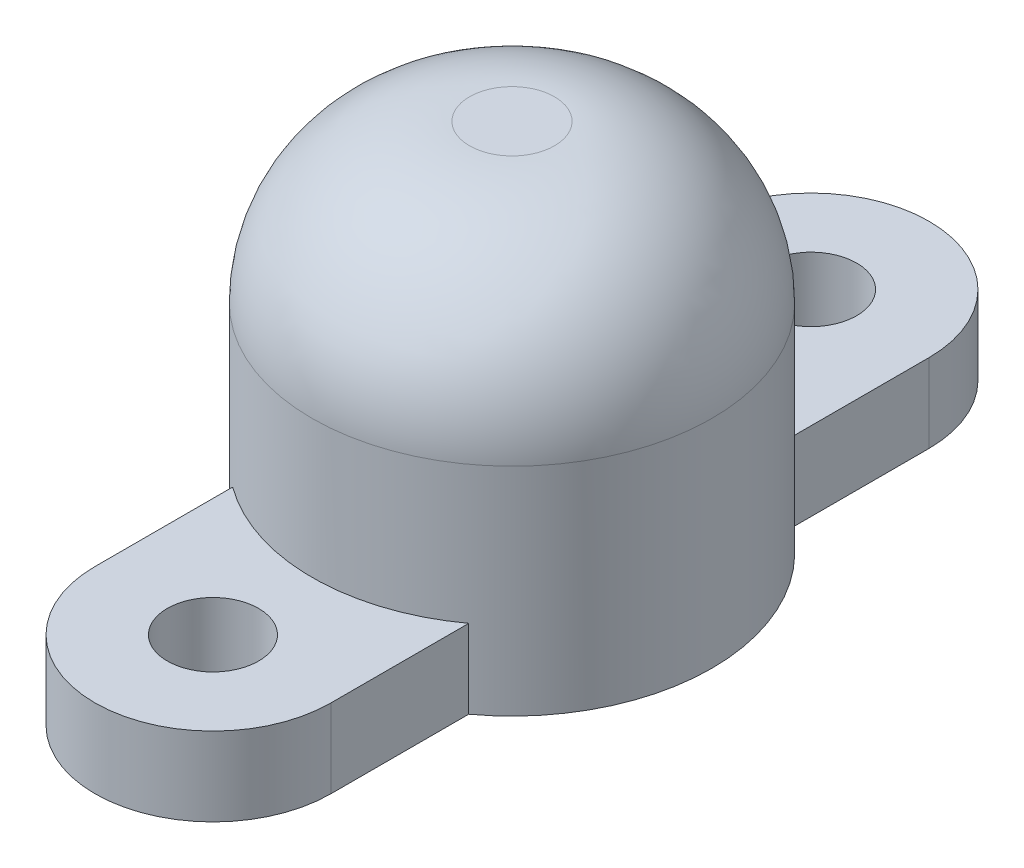
ISO-10303-21;
HEADER;
FILE_DESCRIPTION(('STEP AP214'),'2;1');
FILE_NAME('part.step','',(''),(''),'','','');
FILE_SCHEMA(('AUTOMOTIVE_DESIGN { 1 0 10303 214 1 1 1 1 }'));
ENDSEC;
DATA;
#1=APPLICATION_CONTEXT('core data for automotive mechanical design processes');
#2=APPLICATION_PROTOCOL_DEFINITION('international standard','automotive_design',2000,#1);
#3=PRODUCT_CONTEXT('',#1,'mechanical');
#4=PRODUCT('Part','Part','',(#3));
#5=PRODUCT_RELATED_PRODUCT_CATEGORY('part','',(#4));
#6=PRODUCT_DEFINITION_FORMATION('','',#4);
#7=PRODUCT_DEFINITION_CONTEXT('part definition',#1,'design');
#8=PRODUCT_DEFINITION('design','',#6,#7);
#9=PRODUCT_DEFINITION_SHAPE('','',#8);
#10=(LENGTH_UNIT() NAMED_UNIT(*) SI_UNIT(.MILLI.,.METRE.));
#11=(NAMED_UNIT(*) PLANE_ANGLE_UNIT() SI_UNIT($,.RADIAN.));
#12=(NAMED_UNIT(*) SI_UNIT($,.STERADIAN.) SOLID_ANGLE_UNIT());
#13=UNCERTAINTY_MEASURE_WITH_UNIT(LENGTH_MEASURE(1.E-05),#10,'distance_accuracy_value','');
#14=(GEOMETRIC_REPRESENTATION_CONTEXT(3) GLOBAL_UNCERTAINTY_ASSIGNED_CONTEXT((#13)) GLOBAL_UNIT_ASSIGNED_CONTEXT((#10,
#11,#12)) REPRESENTATION_CONTEXT('',''));
#15=CARTESIAN_POINT('',(0.,0.,0.));
#16=DIRECTION('',(0.,0.,1.));
#17=DIRECTION('',(1.,0.,0.));
#18=AXIS2_PLACEMENT_3D('',#15,#16,#17);
#19=CARTESIAN_POINT('',(0.,23.75,0.));
#20=DIRECTION('',(0.,-1.,0.));
#21=DIRECTION('',(0.,0.,-1.));
#22=AXIS2_PLACEMENT_3D('',#19,#20,#21);
#23=CYLINDRICAL_SURFACE('',#22,12.7);
#24=CARTESIAN_POINT('',(0.,5.,0.));
#25=DIRECTION('',(0.,-1.,0.));
#26=DIRECTION('',(0.,0.,-1.));
#27=AXIS2_PLACEMENT_3D('',#24,#25,#26);
#28=CIRCLE('',#27,12.7);
#29=CARTESIAN_POINT('',(7.49999999999999,5.,10.2489023802552));
#30=VERTEX_POINT('',#29);
#31=CARTESIAN_POINT('',(-7.5,5.,10.2489023802552));
#32=VERTEX_POINT('',#31);
#33=EDGE_CURVE('E11',#30,#32,#28,.T.);
#34=ORIENTED_EDGE('',*,*,#33,.F.);
#35=DIRECTION('',(0.,-1.,0.));
#36=VECTOR('',#35,1.);
#37=CARTESIAN_POINT('',(7.49999999999999,23.75,10.2489023802552));
#38=LINE('',#37,#36);
#39=CARTESIAN_POINT('',(7.49999999999999,0.,10.2489023802552));
#40=VERTEX_POINT('',#39);
#41=EDGE_CURVE('E159',#30,#40,#38,.T.);
#42=ORIENTED_EDGE('',*,*,#41,.T.);
#43=CARTESIAN_POINT('',(0.,0.,0.));
#44=DIRECTION('',(0.,1.,0.));
#45=DIRECTION('',(0.,0.,1.));
#46=AXIS2_PLACEMENT_3D('',#43,#44,#45);
#47=CIRCLE('',#46,12.7);
#48=CARTESIAN_POINT('',(7.5,0.,-10.2489023802552));
#49=VERTEX_POINT('',#48);
#50=EDGE_CURVE('E162',#40,#49,#47,.T.);
#51=ORIENTED_EDGE('',*,*,#50,.T.);
#52=DIRECTION('',(0.,-1.,0.));
#53=VECTOR('',#52,1.);
#54=CARTESIAN_POINT('',(7.5,23.75,-10.2489023802552));
#55=LINE('',#54,#53);
#56=CARTESIAN_POINT('',(7.5,5.,-10.2489023802552));
#57=VERTEX_POINT('',#56);
#58=EDGE_CURVE('E157',#49,#57,#55,.F.);
#59=ORIENTED_EDGE('',*,*,#58,.T.);
#60=CARTESIAN_POINT('',(-7.5,5.,-10.2489023802552));
#61=VERTEX_POINT('',#60);
#62=EDGE_CURVE('E43',#61,#57,#28,.T.);
#63=ORIENTED_EDGE('',*,*,#62,.F.);
#64=DIRECTION('',(0.,-1.,0.));
#65=VECTOR('',#64,1.);
#66=CARTESIAN_POINT('',(-7.5,23.75,-10.2489023802552));
#67=LINE('',#66,#65);
#68=CARTESIAN_POINT('',(-7.5,0.,-10.2489023802552));
#69=VERTEX_POINT('',#68);
#70=EDGE_CURVE('E154',#61,#69,#67,.T.);
#71=ORIENTED_EDGE('',*,*,#70,.T.);
#72=CARTESIAN_POINT('',(-7.5,0.,10.2489023802552));
#73=VERTEX_POINT('',#72);
#74=EDGE_CURVE('E161',#69,#73,#47,.T.);
#75=ORIENTED_EDGE('',*,*,#74,.T.);
#76=DIRECTION('',(0.,-1.,0.));
#77=VECTOR('',#76,1.);
#78=CARTESIAN_POINT('',(-7.5,23.75,10.2489023802552));
#79=LINE('',#78,#77);
#80=EDGE_CURVE('E54',#73,#32,#79,.F.);
#81=ORIENTED_EDGE('',*,*,#80,.T.);
#82=EDGE_LOOP('',(#34,#42,#51,#59,#63,#71,#75,#81));
#83=FACE_BOUND('',#82,.T.);
#84=CARTESIAN_POINT('',(0.,13.75,0.));
#85=DIRECTION('',(0.,1.,0.));
#86=DIRECTION('',(0.,0.,1.));
#87=AXIS2_PLACEMENT_3D('',#84,#85,#86);
#88=CIRCLE('',#87,12.7);
#89=CARTESIAN_POINT('',(0.,13.75,12.7));
#90=VERTEX_POINT('',#89);
#91=EDGE_CURVE('E166',#90,#90,#88,.F.);
#92=ORIENTED_EDGE('',*,*,#91,.T.);
#93=EDGE_LOOP('',(#92));
#94=FACE_BOUND('',#93,.T.);
#95=ADVANCED_FACE('F39',(#83,#94),#23,.T.);
#96=CARTESIAN_POINT('',(0.,23.75,0.));
#97=DIRECTION('',(0.,1.,0.));
#98=DIRECTION('',(0.,0.,1.));
#99=AXIS2_PLACEMENT_3D('',#96,#97,#98);
#100=PLANE('',#99);
#101=CARTESIAN_POINT('',(0.,23.75,0.));
#102=DIRECTION('',(0.,1.,0.));
#103=DIRECTION('',(0.,0.,1.));
#104=AXIS2_PLACEMENT_3D('',#101,#102,#103);
#105=CIRCLE('',#104,2.7);
#106=CARTESIAN_POINT('',(0.,23.75,2.7));
#107=VERTEX_POINT('',#106);
#108=EDGE_CURVE('E164',#107,#107,#105,.T.);
#109=ORIENTED_EDGE('',*,*,#108,.T.);
#110=EDGE_LOOP('',(#109));
#111=FACE_BOUND('',#110,.T.);
#112=ADVANCED_FACE('F206',(#111),#100,.T.);
#113=CARTESIAN_POINT('',(0.,0.,0.));
#114=DIRECTION('',(0.,1.,0.));
#115=DIRECTION('',(0.,0.,1.));
#116=AXIS2_PLACEMENT_3D('',#113,#114,#115);
#117=PLANE('',#116);
#118=ORIENTED_EDGE('',*,*,#74,.F.);
#119=DIRECTION('',(0.,0.,-1.));
#120=VECTOR('',#119,1.);
#121=CARTESIAN_POINT('',(-7.50000000000001,0.,19.));
#122=LINE('',#121,#120);
#123=CARTESIAN_POINT('',(-7.49999999999999,0.,-19.));
#124=VERTEX_POINT('',#123);
#125=EDGE_CURVE('E142',#69,#124,#122,.T.);
#126=ORIENTED_EDGE('',*,*,#125,.T.);
#127=CARTESIAN_POINT('',(0.,0.,-19.));
#128=DIRECTION('',(0.,-1.,0.));
#129=DIRECTION('',(0.,0.,-1.));
#130=AXIS2_PLACEMENT_3D('',#127,#128,#129);
#131=CIRCLE('',#130,7.5);
#132=CARTESIAN_POINT('',(7.5,0.,-19.));
#133=VERTEX_POINT('',#132);
#134=EDGE_CURVE('E145',#124,#133,#131,.T.);
#135=ORIENTED_EDGE('',*,*,#134,.T.);
#136=DIRECTION('',(0.,0.,1.));
#137=VECTOR('',#136,1.);
#138=CARTESIAN_POINT('',(7.49999999999999,0.,19.));
#139=LINE('',#138,#137);
#140=EDGE_CURVE('E126',#133,#49,#139,.T.);
#141=ORIENTED_EDGE('',*,*,#140,.T.);
#142=ORIENTED_EDGE('',*,*,#50,.F.);
#143=CARTESIAN_POINT('',(7.49999999999999,0.,19.));
#144=VERTEX_POINT('',#143);
#145=EDGE_CURVE('E129',#40,#144,#139,.T.);
#146=ORIENTED_EDGE('',*,*,#145,.T.);
#147=CARTESIAN_POINT('',(0.,0.,19.));
#148=DIRECTION('',(0.,-1.,0.));
#149=DIRECTION('',(0.,0.,-1.));
#150=AXIS2_PLACEMENT_3D('',#147,#148,#149);
#151=CIRCLE('',#150,7.5);
#152=CARTESIAN_POINT('',(-7.50000000000001,0.,19.));
#153=VERTEX_POINT('',#152);
#154=EDGE_CURVE('E140',#144,#153,#151,.T.);
#155=ORIENTED_EDGE('',*,*,#154,.T.);
#156=EDGE_CURVE('E106',#153,#73,#122,.T.);
#157=ORIENTED_EDGE('',*,*,#156,.T.);
#158=EDGE_LOOP('',(#118,#126,#135,#141,#142,#146,#155,#157));
#159=FACE_BOUND('',#158,.T.);
#160=CARTESIAN_POINT('',(0.,0.,-19.));
#161=DIRECTION('',(0.,-1.,0.));
#162=DIRECTION('',(0.,0.,-1.));
#163=AXIS2_PLACEMENT_3D('',#160,#161,#162);
#164=CIRCLE('',#163,2.9);
#165=CARTESIAN_POINT('',(0.,0.,-21.9));
#166=VERTEX_POINT('',#165);
#167=EDGE_CURVE('E246',#166,#166,#164,.T.);
#168=ORIENTED_EDGE('',*,*,#167,.F.);
#169=EDGE_LOOP('',(#168));
#170=FACE_BOUND('',#169,.T.);
#171=CARTESIAN_POINT('',(0.,0.,19.));
#172=DIRECTION('',(0.,-1.,0.));
#173=DIRECTION('',(0.,0.,-1.));
#174=AXIS2_PLACEMENT_3D('',#171,#172,#173);
#175=CIRCLE('',#174,2.9);
#176=CARTESIAN_POINT('',(0.,0.,16.1));
#177=VERTEX_POINT('',#176);
#178=EDGE_CURVE('E132',#177,#177,#175,.T.);
#179=ORIENTED_EDGE('',*,*,#178,.F.);
#180=EDGE_LOOP('',(#179));
#181=FACE_BOUND('',#180,.T.);
#182=ADVANCED_FACE('F189',(#159,#170,#181),#117,.F.);
#183=CARTESIAN_POINT('',(0.,13.75,0.));
#184=DIRECTION('',(0.,1.,0.));
#185=DIRECTION('',(0.,0.,1.));
#186=AXIS2_PLACEMENT_3D('',#183,#184,#185);
#187=DEGENERATE_TOROIDAL_SURFACE('',#186,2.7,10.,.T.);
#188=ORIENTED_EDGE('',*,*,#91,.F.);
#189=EDGE_LOOP('',(#188));
#190=FACE_BOUND('',#189,.T.);
#191=ORIENTED_EDGE('',*,*,#108,.F.);
#192=EDGE_LOOP('',(#191));
#193=FACE_BOUND('',#192,.T.);
#194=ADVANCED_FACE('F41',(#190,#193),#187,.T.);
#195=CARTESIAN_POINT('',(0.,5.,-19.));
#196=DIRECTION('',(0.,-1.,0.));
#197=DIRECTION('',(0.,0.,-1.));
#198=AXIS2_PLACEMENT_3D('',#195,#196,#197);
#199=CYLINDRICAL_SURFACE('',#198,2.9);
#200=CARTESIAN_POINT('',(0.,5.,-19.));
#201=DIRECTION('',(0.,-1.,0.));
#202=DIRECTION('',(0.,0.,-1.));
#203=AXIS2_PLACEMENT_3D('',#200,#201,#202);
#204=CIRCLE('',#203,2.9);
#205=CARTESIAN_POINT('',(0.,5.,-21.9));
#206=VERTEX_POINT('',#205);
#207=EDGE_CURVE('E244',#206,#206,#204,.T.);
#208=ORIENTED_EDGE('',*,*,#207,.F.);
#209=EDGE_LOOP('',(#208));
#210=FACE_BOUND('',#209,.T.);
#211=ORIENTED_EDGE('',*,*,#167,.T.);
#212=EDGE_LOOP('',(#211));
#213=FACE_BOUND('',#212,.T.);
#214=ADVANCED_FACE('F220',(#210,#213),#199,.F.);
#215=CARTESIAN_POINT('',(0.,5.,-19.));
#216=DIRECTION('',(0.,-1.,0.));
#217=DIRECTION('',(0.,0.,-1.));
#218=AXIS2_PLACEMENT_3D('',#215,#216,#217);
#219=CYLINDRICAL_SURFACE('',#218,7.5);
#220=ORIENTED_EDGE('',*,*,#134,.F.);
#221=DIRECTION('',(0.,-1.,0.));
#222=VECTOR('',#221,1.);
#223=CARTESIAN_POINT('',(-7.49999999999999,5.,-19.));
#224=LINE('',#223,#222);
#225=CARTESIAN_POINT('',(-7.49999999999999,5.,-19.));
#226=VERTEX_POINT('',#225);
#227=EDGE_CURVE('E111',#226,#124,#224,.T.);
#228=ORIENTED_EDGE('',*,*,#227,.F.);
#229=CARTESIAN_POINT('',(0.,5.,-19.));
#230=DIRECTION('',(0.,-1.,0.));
#231=DIRECTION('',(0.,0.,-1.));
#232=AXIS2_PLACEMENT_3D('',#229,#230,#231);
#233=CIRCLE('',#232,7.5);
#234=CARTESIAN_POINT('',(7.5,5.,-19.));
#235=VERTEX_POINT('',#234);
#236=EDGE_CURVE('E119',#226,#235,#233,.T.);
#237=ORIENTED_EDGE('',*,*,#236,.T.);
#238=DIRECTION('',(0.,-1.,0.));
#239=VECTOR('',#238,1.);
#240=CARTESIAN_POINT('',(7.5,5.,-19.));
#241=LINE('',#240,#239);
#242=EDGE_CURVE('E149',#235,#133,#241,.T.);
#243=ORIENTED_EDGE('',*,*,#242,.T.);
#244=EDGE_LOOP('',(#220,#228,#237,#243));
#245=FACE_BOUND('',#244,.T.);
#246=ADVANCED_FACE('F184',(#245),#219,.T.);
#247=CARTESIAN_POINT('',(0.,5.,19.));
#248=DIRECTION('',(0.,-1.,0.));
#249=DIRECTION('',(0.,0.,-1.));
#250=AXIS2_PLACEMENT_3D('',#247,#248,#249);
#251=PLANE('',#250);
#252=ORIENTED_EDGE('',*,*,#207,.T.);
#253=EDGE_LOOP('',(#252));
#254=FACE_BOUND('',#253,.T.);
#255=DIRECTION('',(0.,0.,-1.));
#256=VECTOR('',#255,1.);
#257=CARTESIAN_POINT('',(-7.50000000000001,5.,19.));
#258=LINE('',#257,#256);
#259=EDGE_CURVE('E120',#61,#226,#258,.T.);
#260=ORIENTED_EDGE('',*,*,#259,.F.);
#261=ORIENTED_EDGE('',*,*,#62,.T.);
#262=DIRECTION('',(0.,0.,1.));
#263=VECTOR('',#262,1.);
#264=CARTESIAN_POINT('',(7.49999999999999,5.,19.));
#265=LINE('',#264,#263);
#266=EDGE_CURVE('E112',#235,#57,#265,.T.);
#267=ORIENTED_EDGE('',*,*,#266,.F.);
#268=ORIENTED_EDGE('',*,*,#236,.F.);
#269=EDGE_LOOP('',(#260,#261,#267,#268));
#270=FACE_BOUND('',#269,.T.);
#271=ADVANCED_FACE('F174',(#254,#270),#251,.F.);
#272=CARTESIAN_POINT('',(-7.50000000000001,5.,19.));
#273=DIRECTION('',(-1.,0.,0.));
#274=DIRECTION('',(0.,0.,1.));
#275=AXIS2_PLACEMENT_3D('',#272,#273,#274);
#276=PLANE('',#275);
#277=ORIENTED_EDGE('',*,*,#70,.F.);
#278=ORIENTED_EDGE('',*,*,#259,.T.);
#279=ORIENTED_EDGE('',*,*,#227,.T.);
#280=ORIENTED_EDGE('',*,*,#125,.F.);
#281=EDGE_LOOP('',(#277,#278,#279,#280));
#282=FACE_BOUND('',#281,.T.);
#283=ADVANCED_FACE('F187',(#282),#276,.T.);
#284=CARTESIAN_POINT('',(7.49999999999999,5.,19.));
#285=DIRECTION('',(1.,0.,0.));
#286=DIRECTION('',(0.,0.,-1.));
#287=AXIS2_PLACEMENT_3D('',#284,#285,#286);
#288=PLANE('',#287);
#289=ORIENTED_EDGE('',*,*,#58,.F.);
#290=ORIENTED_EDGE('',*,*,#140,.F.);
#291=ORIENTED_EDGE('',*,*,#242,.F.);
#292=ORIENTED_EDGE('',*,*,#266,.T.);
#293=EDGE_LOOP('',(#289,#290,#291,#292));
#294=FACE_BOUND('',#293,.T.);
#295=ADVANCED_FACE('F179',(#294),#288,.T.);
#296=CARTESIAN_POINT('',(0.,5.,19.));
#297=DIRECTION('',(0.,-1.,0.));
#298=DIRECTION('',(0.,0.,-1.));
#299=AXIS2_PLACEMENT_3D('',#296,#297,#298);
#300=CIRCLE('',#299,2.9);
#301=CARTESIAN_POINT('',(0.,5.,16.1));
#302=VERTEX_POINT('',#301);
#303=EDGE_CURVE('E143',#302,#302,#300,.T.);
#304=ORIENTED_EDGE('',*,*,#303,.T.);
#305=EDGE_LOOP('',(#304));
#306=FACE_BOUND('',#305,.T.);
#307=CARTESIAN_POINT('',(7.49999999999999,5.,19.));
#308=VERTEX_POINT('',#307);
#309=EDGE_CURVE('E137',#30,#308,#265,.T.);
#310=ORIENTED_EDGE('',*,*,#309,.F.);
#311=ORIENTED_EDGE('',*,*,#33,.T.);
#312=CARTESIAN_POINT('',(-7.50000000000001,5.,19.));
#313=VERTEX_POINT('',#312);
#314=EDGE_CURVE('E104',#313,#32,#258,.T.);
#315=ORIENTED_EDGE('',*,*,#314,.F.);
#316=CARTESIAN_POINT('',(0.,5.,19.));
#317=DIRECTION('',(0.,-1.,0.));
#318=DIRECTION('',(0.,0.,-1.));
#319=AXIS2_PLACEMENT_3D('',#316,#317,#318);
#320=CIRCLE('',#319,7.5);
#321=EDGE_CURVE('E118',#308,#313,#320,.T.);
#322=ORIENTED_EDGE('',*,*,#321,.F.);
#323=EDGE_LOOP('',(#310,#311,#315,#322));
#324=FACE_BOUND('',#323,.T.);
#325=ADVANCED_FACE('F117',(#306,#324),#251,.F.);
#326=ORIENTED_EDGE('',*,*,#41,.F.);
#327=ORIENTED_EDGE('',*,*,#309,.T.);
#328=DIRECTION('',(0.,-1.,0.));
#329=VECTOR('',#328,1.);
#330=CARTESIAN_POINT('',(7.49999999999999,5.,19.));
#331=LINE('',#330,#329);
#332=EDGE_CURVE('E125',#308,#144,#331,.T.);
#333=ORIENTED_EDGE('',*,*,#332,.T.);
#334=ORIENTED_EDGE('',*,*,#145,.F.);
#335=EDGE_LOOP('',(#326,#327,#333,#334));
#336=FACE_BOUND('',#335,.T.);
#337=ADVANCED_FACE('F193',(#336),#288,.T.);
#338=ORIENTED_EDGE('',*,*,#80,.F.);
#339=ORIENTED_EDGE('',*,*,#156,.F.);
#340=DIRECTION('',(0.,-1.,0.));
#341=VECTOR('',#340,1.);
#342=CARTESIAN_POINT('',(-7.50000000000001,5.,19.));
#343=LINE('',#342,#341);
#344=EDGE_CURVE('E101',#313,#153,#343,.T.);
#345=ORIENTED_EDGE('',*,*,#344,.F.);
#346=ORIENTED_EDGE('',*,*,#314,.T.);
#347=EDGE_LOOP('',(#338,#339,#345,#346));
#348=FACE_BOUND('',#347,.T.);
#349=ADVANCED_FACE('F103',(#348),#276,.T.);
#350=CARTESIAN_POINT('',(0.,5.,19.));
#351=DIRECTION('',(0.,-1.,0.));
#352=DIRECTION('',(0.,0.,-1.));
#353=AXIS2_PLACEMENT_3D('',#350,#351,#352);
#354=CYLINDRICAL_SURFACE('',#353,7.5);
#355=ORIENTED_EDGE('',*,*,#154,.F.);
#356=ORIENTED_EDGE('',*,*,#332,.F.);
#357=ORIENTED_EDGE('',*,*,#321,.T.);
#358=ORIENTED_EDGE('',*,*,#344,.T.);
#359=EDGE_LOOP('',(#355,#356,#357,#358));
#360=FACE_BOUND('',#359,.T.);
#361=ADVANCED_FACE('F123',(#360),#354,.T.);
#362=CARTESIAN_POINT('',(0.,5.,19.));
#363=DIRECTION('',(0.,-1.,0.));
#364=DIRECTION('',(0.,0.,-1.));
#365=AXIS2_PLACEMENT_3D('',#362,#363,#364);
#366=CYLINDRICAL_SURFACE('',#365,2.9);
#367=ORIENTED_EDGE('',*,*,#303,.F.);
#368=EDGE_LOOP('',(#367));
#369=FACE_BOUND('',#368,.T.);
#370=ORIENTED_EDGE('',*,*,#178,.T.);
#371=EDGE_LOOP('',(#370));
#372=FACE_BOUND('',#371,.T.);
#373=ADVANCED_FACE('F217',(#369,#372),#366,.F.);
#374=CLOSED_SHELL('',(#95,#112,#182,#194,#214,#246,#271,#283,#295,#325,#337,#349,#361,#373));
#375=MANIFOLD_SOLID_BREP('B2',#374);
#376=ADVANCED_BREP_SHAPE_REPRESENTATION('',(#18,#375),#14);
#377=SHAPE_DEFINITION_REPRESENTATION(#9,#376);
ENDSEC;
END-ISO-10303-21;
